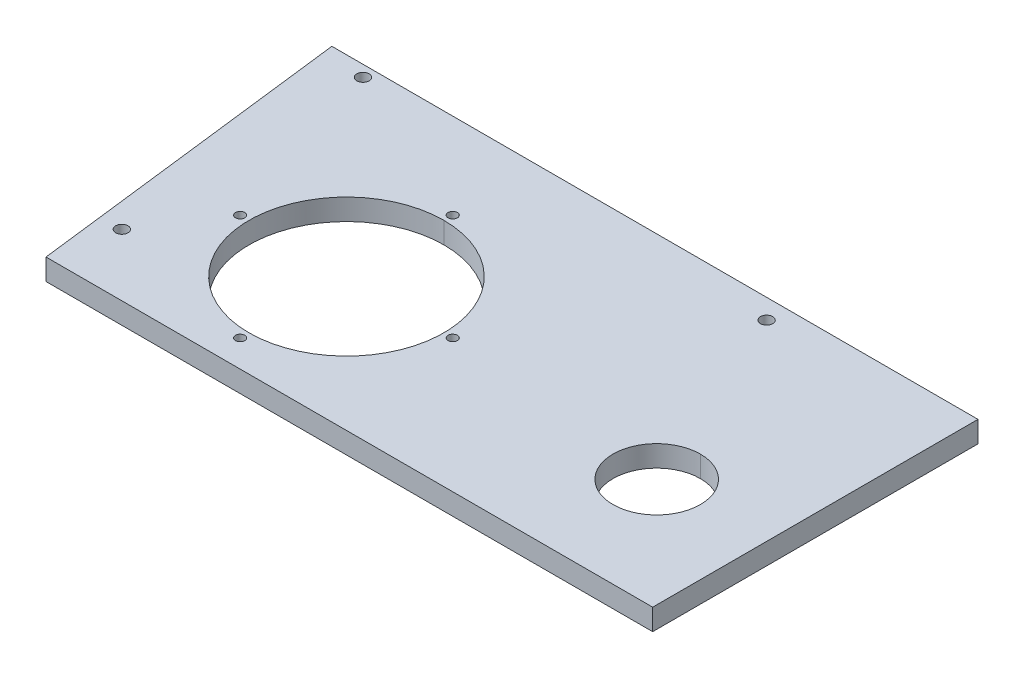
ISO-10303-21;
HEADER;
FILE_DESCRIPTION(('STEP AP214'),'2;1');
FILE_NAME('part.step','',(''),(''),'','','');
FILE_SCHEMA(('AUTOMOTIVE_DESIGN { 1 0 10303 214 1 1 1 1 }'));
ENDSEC;
DATA;
#1=APPLICATION_CONTEXT('core data for automotive mechanical design processes');
#2=APPLICATION_PROTOCOL_DEFINITION('international standard','automotive_design',2000,#1);
#3=PRODUCT_CONTEXT('',#1,'mechanical');
#4=PRODUCT('Part','Part','',(#3));
#5=PRODUCT_RELATED_PRODUCT_CATEGORY('part','',(#4));
#6=PRODUCT_DEFINITION_FORMATION('','',#4);
#7=PRODUCT_DEFINITION_CONTEXT('part definition',#1,'design');
#8=PRODUCT_DEFINITION('design','',#6,#7);
#9=PRODUCT_DEFINITION_SHAPE('','',#8);
#10=(LENGTH_UNIT() NAMED_UNIT(*) SI_UNIT(.MILLI.,.METRE.));
#11=(NAMED_UNIT(*) PLANE_ANGLE_UNIT() SI_UNIT($,.RADIAN.));
#12=(NAMED_UNIT(*) SI_UNIT($,.STERADIAN.) SOLID_ANGLE_UNIT());
#13=UNCERTAINTY_MEASURE_WITH_UNIT(LENGTH_MEASURE(1.E-05),#10,'distance_accuracy_value','');
#14=(GEOMETRIC_REPRESENTATION_CONTEXT(3) GLOBAL_UNCERTAINTY_ASSIGNED_CONTEXT((#13)) GLOBAL_UNIT_ASSIGNED_CONTEXT((#10,
#11,#12)) REPRESENTATION_CONTEXT('',''));
#15=CARTESIAN_POINT('',(0.,0.,0.));
#16=DIRECTION('',(0.,0.,1.));
#17=DIRECTION('',(1.,0.,0.));
#18=AXIS2_PLACEMENT_3D('',#15,#16,#17);
#19=CARTESIAN_POINT('',(54.6099999999999,11.43,127.));
#20=DIRECTION('',(0.,-1.,0.));
#21=DIRECTION('',(0.,0.,-1.));
#22=AXIS2_PLACEMENT_3D('',#19,#20,#21);
#23=CYLINDRICAL_SURFACE('',#22,23.5);
#24=CARTESIAN_POINT('',(54.6099999999999,11.43,127.));
#25=DIRECTION('',(0.,1.,0.));
#26=DIRECTION('',(0.,0.,1.));
#27=AXIS2_PLACEMENT_3D('',#24,#25,#26);
#28=CIRCLE('',#27,23.5);
#29=CARTESIAN_POINT('',(54.6099999999999,11.43,103.5));
#30=VERTEX_POINT('',#29);
#31=CARTESIAN_POINT('',(54.6099999999999,11.43,150.5));
#32=VERTEX_POINT('',#31);
#33=EDGE_CURVE('E161',#30,#32,#28,.T.);
#34=ORIENTED_EDGE('',*,*,#33,.T.);
#35=DIRECTION('',(0.,-1.,0.));
#36=VECTOR('',#35,1.);
#37=CARTESIAN_POINT('',(54.6099999999999,11.43,150.5));
#38=LINE('',#37,#36);
#39=CARTESIAN_POINT('',(54.6099999999999,0.,150.5));
#40=VERTEX_POINT('',#39);
#41=EDGE_CURVE('E12',#32,#40,#38,.T.);
#42=ORIENTED_EDGE('',*,*,#41,.T.);
#43=CARTESIAN_POINT('',(54.6099999999999,0.,127.));
#44=DIRECTION('',(0.,1.,0.));
#45=DIRECTION('',(0.,0.,1.));
#46=AXIS2_PLACEMENT_3D('',#43,#44,#45);
#47=CIRCLE('',#46,23.5);
#48=CARTESIAN_POINT('',(54.6099999999999,0.,103.5));
#49=VERTEX_POINT('',#48);
#50=EDGE_CURVE('E163',#49,#40,#47,.T.);
#51=ORIENTED_EDGE('',*,*,#50,.F.);
#52=DIRECTION('',(0.,1.,0.));
#53=VECTOR('',#52,1.);
#54=CARTESIAN_POINT('',(54.6099999999999,11.43,103.5));
#55=LINE('',#54,#53);
#56=EDGE_CURVE('E56',#49,#30,#55,.T.);
#57=ORIENTED_EDGE('',*,*,#56,.T.);
#58=EDGE_LOOP('',(#34,#42,#51,#57));
#59=FACE_BOUND('',#58,.T.);
#60=ADVANCED_FACE('F47',(#59),#23,.F.);
#61=CARTESIAN_POINT('',(-123.19,11.43,116.001477371938));
#62=DIRECTION('',(0.,-1.,0.));
#63=DIRECTION('',(0.,0.,-1.));
#64=AXIS2_PLACEMENT_3D('',#61,#62,#63);
#65=CYLINDRICAL_SURFACE('',#64,52.3875);
#66=CARTESIAN_POINT('',(-123.19,11.43,116.001477371938));
#67=DIRECTION('',(0.,1.,0.));
#68=DIRECTION('',(0.,0.,1.));
#69=AXIS2_PLACEMENT_3D('',#66,#67,#68);
#70=CIRCLE('',#69,52.3875);
#71=CARTESIAN_POINT('',(-123.19,11.43,63.6139773719377));
#72=VERTEX_POINT('',#71);
#73=CARTESIAN_POINT('',(-123.19,11.43,168.388977371938));
#74=VERTEX_POINT('',#73);
#75=EDGE_CURVE('E176',#72,#74,#70,.T.);
#76=ORIENTED_EDGE('',*,*,#75,.T.);
#77=DIRECTION('',(0.,-1.,0.));
#78=VECTOR('',#77,1.);
#79=CARTESIAN_POINT('',(-123.19,11.43,168.388977371938));
#80=LINE('',#79,#78);
#81=CARTESIAN_POINT('',(-123.19,0.,168.388977371938));
#82=VERTEX_POINT('',#81);
#83=EDGE_CURVE('E141',#74,#82,#80,.T.);
#84=ORIENTED_EDGE('',*,*,#83,.T.);
#85=CARTESIAN_POINT('',(-123.19,0.,116.001477371938));
#86=DIRECTION('',(0.,1.,0.));
#87=DIRECTION('',(0.,0.,1.));
#88=AXIS2_PLACEMENT_3D('',#85,#86,#87);
#89=CIRCLE('',#88,52.3875);
#90=CARTESIAN_POINT('',(-123.19,0.,63.6139773719377));
#91=VERTEX_POINT('',#90);
#92=EDGE_CURVE('E168',#91,#82,#89,.T.);
#93=ORIENTED_EDGE('',*,*,#92,.F.);
#94=DIRECTION('',(0.,1.,0.));
#95=VECTOR('',#94,1.);
#96=CARTESIAN_POINT('',(-123.19,11.43,63.6139773719377));
#97=LINE('',#96,#95);
#98=EDGE_CURVE('E137',#91,#72,#97,.T.);
#99=ORIENTED_EDGE('',*,*,#98,.T.);
#100=EDGE_LOOP('',(#76,#84,#93,#99));
#101=FACE_BOUND('',#100,.T.);
#102=ADVANCED_FACE('F210',(#101),#65,.F.);
#103=CARTESIAN_POINT('',(0.,11.43,0.));
#104=DIRECTION('',(0.,1.,0.));
#105=DIRECTION('',(0.,0.,1.));
#106=AXIS2_PLACEMENT_3D('',#103,#104,#105);
#107=PLANE('',#106);
#108=ORIENTED_EDGE('',*,*,#33,.F.);
#109=EDGE_CURVE('E165',#32,#30,#28,.T.);
#110=ORIENTED_EDGE('',*,*,#109,.F.);
#111=EDGE_LOOP('',(#108,#110));
#112=FACE_BOUND('',#111,.T.);
#113=DIRECTION('',(0.120650785372085,0.,0.992695012573902));
#114=VECTOR('',#113,1.);
#115=CARTESIAN_POINT('',(-234.329030184165,11.43,12.7));
#116=LINE('',#115,#114);
#117=CARTESIAN_POINT('',(-234.329030184165,11.43,12.7));
#118=VERTEX_POINT('',#117);
#119=CARTESIAN_POINT('',(-213.064788009342,11.43,187.658721470491));
#120=VERTEX_POINT('',#119);
#121=EDGE_CURVE('E123',#118,#120,#116,.T.);
#122=ORIENTED_EDGE('',*,*,#121,.T.);
#123=DIRECTION('',(0.999999986376493,0.,-0.000165066694148165));
#124=VECTOR('',#123,1.);
#125=CARTESIAN_POINT('',(-213.064788009342,11.43,187.658721470491));
#126=LINE('',#125,#124);
#127=CARTESIAN_POINT('',(113.061428613431,11.43,187.604888893304));
#128=VERTEX_POINT('',#127);
#129=EDGE_CURVE('E112',#120,#128,#126,.T.);
#130=ORIENTED_EDGE('',*,*,#129,.T.);
#131=DIRECTION('',(0.,0.,-1.));
#132=VECTOR('',#131,1.);
#133=CARTESIAN_POINT('',(113.061428613431,11.43,12.7));
#134=LINE('',#133,#132);
#135=CARTESIAN_POINT('',(113.061428613431,11.43,12.7));
#136=VERTEX_POINT('',#135);
#137=EDGE_CURVE('E122',#128,#136,#134,.T.);
#138=ORIENTED_EDGE('',*,*,#137,.T.);
#139=DIRECTION('',(-1.,0.,0.));
#140=VECTOR('',#139,1.);
#141=CARTESIAN_POINT('',(-234.329030184165,11.43,12.7));
#142=LINE('',#141,#140);
#143=EDGE_CURVE('E129',#136,#118,#142,.T.);
#144=ORIENTED_EDGE('',*,*,#143,.T.);
#145=EDGE_LOOP('',(#122,#130,#138,#144));
#146=FACE_BOUND('',#145,.T.);
#147=ORIENTED_EDGE('',*,*,#75,.F.);
#148=EDGE_CURVE('E178',#74,#72,#70,.T.);
#149=ORIENTED_EDGE('',*,*,#148,.F.);
#150=EDGE_LOOP('',(#147,#149));
#151=FACE_BOUND('',#150,.T.);
#152=CARTESIAN_POINT('',(-205.575185514482,11.43,154.375359311032));
#153=DIRECTION('',(0.,-1.,0.));
#154=DIRECTION('',(0.,0.,-1.));
#155=AXIS2_PLACEMENT_3D('',#152,#153,#154);
#156=CIRCLE('',#155,3.3);
#157=CARTESIAN_POINT('',(-205.575185514482,11.43,151.075359311032));
#158=VERTEX_POINT('',#157);
#159=EDGE_CURVE('E172',#158,#158,#156,.T.);
#160=ORIENTED_EDGE('',*,*,#159,.T.);
#161=EDGE_LOOP('',(#160));
#162=FACE_BOUND('',#161,.T.);
#163=CARTESIAN_POINT('',(-211.518182886176,11.43,18.79817874396));
#164=DIRECTION('',(0.,-1.,0.));
#165=DIRECTION('',(0.,0.,-1.));
#166=AXIS2_PLACEMENT_3D('',#163,#164,#165);
#167=CIRCLE('',#166,3.3);
#168=CARTESIAN_POINT('',(-211.518182886176,11.43,15.49817874396));
#169=VERTEX_POINT('',#168);
#170=EDGE_CURVE('E266',#169,#169,#167,.T.);
#171=ORIENTED_EDGE('',*,*,#170,.T.);
#172=EDGE_LOOP('',(#171));
#173=FACE_BOUND('',#172,.T.);
#174=CARTESIAN_POINT('',(10.0337048667491,11.43,23.3341973645329));
#175=DIRECTION('',(0.,-1.,0.));
#176=DIRECTION('',(0.,0.,-1.));
#177=AXIS2_PLACEMENT_3D('',#174,#175,#176);
#178=CIRCLE('',#177,3.3);
#179=CARTESIAN_POINT('',(10.0337048667491,11.43,20.0341973645329));
#180=VERTEX_POINT('',#179);
#181=EDGE_CURVE('E272',#180,#180,#178,.T.);
#182=ORIENTED_EDGE('',*,*,#181,.T.);
#183=EDGE_LOOP('',(#182));
#184=FACE_BOUND('',#183,.T.);
#185=CARTESIAN_POINT('',(-123.19,11.43,173.151477371938));
#186=DIRECTION('',(0.,-1.,0.));
#187=DIRECTION('',(0.,0.,-1.));
#188=AXIS2_PLACEMENT_3D('',#185,#186,#187);
#189=CIRCLE('',#188,2.5);
#190=CARTESIAN_POINT('',(-123.19,11.43,170.651477371938));
#191=VERTEX_POINT('',#190);
#192=EDGE_CURVE('E276',#191,#191,#189,.T.);
#193=ORIENTED_EDGE('',*,*,#192,.T.);
#194=EDGE_LOOP('',(#193));
#195=FACE_BOUND('',#194,.T.);
#196=CARTESIAN_POINT('',(-180.34,11.43,116.001477371938));
#197=DIRECTION('',(0.,-1.,0.));
#198=DIRECTION('',(0.,0.,-1.));
#199=AXIS2_PLACEMENT_3D('',#196,#197,#198);
#200=CIRCLE('',#199,2.5);
#201=CARTESIAN_POINT('',(-180.34,11.43,113.501477371938));
#202=VERTEX_POINT('',#201);
#203=EDGE_CURVE('E280',#202,#202,#200,.T.);
#204=ORIENTED_EDGE('',*,*,#203,.T.);
#205=EDGE_LOOP('',(#204));
#206=FACE_BOUND('',#205,.T.);
#207=CARTESIAN_POINT('',(-123.19,11.43,58.8514773719377));
#208=DIRECTION('',(0.,-1.,0.));
#209=DIRECTION('',(0.,0.,-1.));
#210=AXIS2_PLACEMENT_3D('',#207,#208,#209);
#211=CIRCLE('',#210,2.5);
#212=CARTESIAN_POINT('',(-123.19,11.43,56.3514773719377));
#213=VERTEX_POINT('',#212);
#214=EDGE_CURVE('E284',#213,#213,#211,.T.);
#215=ORIENTED_EDGE('',*,*,#214,.T.);
#216=EDGE_LOOP('',(#215));
#217=FACE_BOUND('',#216,.T.);
#218=CARTESIAN_POINT('',(-66.04,11.43,116.001477371938));
#219=DIRECTION('',(0.,-1.,0.));
#220=DIRECTION('',(0.,0.,-1.));
#221=AXIS2_PLACEMENT_3D('',#218,#219,#220);
#222=CIRCLE('',#221,2.5);
#223=CARTESIAN_POINT('',(-66.04,11.43,113.501477371938));
#224=VERTEX_POINT('',#223);
#225=EDGE_CURVE('E288',#224,#224,#222,.T.);
#226=ORIENTED_EDGE('',*,*,#225,.T.);
#227=EDGE_LOOP('',(#226));
#228=FACE_BOUND('',#227,.T.);
#229=ADVANCED_FACE('F126',(#112,#146,#151,#162,#173,#184,#195,#206,#217,#228),#107,.T.);
#230=CARTESIAN_POINT('',(0.,0.,0.));
#231=DIRECTION('',(0.,1.,0.));
#232=DIRECTION('',(0.,0.,1.));
#233=AXIS2_PLACEMENT_3D('',#230,#231,#232);
#234=PLANE('',#233);
#235=CARTESIAN_POINT('',(-66.04,0.,116.001477371938));
#236=DIRECTION('',(0.,-1.,0.));
#237=DIRECTION('',(0.,0.,-1.));
#238=AXIS2_PLACEMENT_3D('',#235,#236,#237);
#239=CIRCLE('',#238,2.49999999999999);
#240=CARTESIAN_POINT('',(-66.04,0.,113.501477371938));
#241=VERTEX_POINT('',#240);
#242=EDGE_CURVE('E241',#241,#241,#239,.T.);
#243=ORIENTED_EDGE('',*,*,#242,.F.);
#244=EDGE_LOOP('',(#243));
#245=FACE_BOUND('',#244,.T.);
#246=CARTESIAN_POINT('',(-123.19,0.,58.8514773719377));
#247=DIRECTION('',(0.,-1.,0.));
#248=DIRECTION('',(0.,0.,-1.));
#249=AXIS2_PLACEMENT_3D('',#246,#247,#248);
#250=CIRCLE('',#249,2.49999999999999);
#251=CARTESIAN_POINT('',(-123.19,0.,56.3514773719378));
#252=VERTEX_POINT('',#251);
#253=EDGE_CURVE('E245',#252,#252,#250,.T.);
#254=ORIENTED_EDGE('',*,*,#253,.F.);
#255=EDGE_LOOP('',(#254));
#256=FACE_BOUND('',#255,.T.);
#257=CARTESIAN_POINT('',(-180.34,0.,116.001477371938));
#258=DIRECTION('',(0.,-1.,0.));
#259=DIRECTION('',(0.,0.,-1.));
#260=AXIS2_PLACEMENT_3D('',#257,#258,#259);
#261=CIRCLE('',#260,2.49999999999997);
#262=CARTESIAN_POINT('',(-180.34,0.,113.501477371938));
#263=VERTEX_POINT('',#262);
#264=EDGE_CURVE('E249',#263,#263,#261,.T.);
#265=ORIENTED_EDGE('',*,*,#264,.F.);
#266=EDGE_LOOP('',(#265));
#267=FACE_BOUND('',#266,.T.);
#268=CARTESIAN_POINT('',(-123.19,0.,173.151477371938));
#269=DIRECTION('',(0.,-1.,0.));
#270=DIRECTION('',(0.,0.,-1.));
#271=AXIS2_PLACEMENT_3D('',#268,#269,#270);
#272=CIRCLE('',#271,2.49999999999999);
#273=CARTESIAN_POINT('',(-123.19,0.,170.651477371938));
#274=VERTEX_POINT('',#273);
#275=EDGE_CURVE('E253',#274,#274,#272,.T.);
#276=ORIENTED_EDGE('',*,*,#275,.F.);
#277=EDGE_LOOP('',(#276));
#278=FACE_BOUND('',#277,.T.);
#279=CARTESIAN_POINT('',(10.0337048667491,0.,23.3341973645329));
#280=DIRECTION('',(0.,-1.,0.));
#281=DIRECTION('',(0.,0.,-1.));
#282=AXIS2_PLACEMENT_3D('',#279,#280,#281);
#283=CIRCLE('',#282,3.29999999999999);
#284=CARTESIAN_POINT('',(10.0337048667491,0.,20.0341973645329));
#285=VERTEX_POINT('',#284);
#286=EDGE_CURVE('E257',#285,#285,#283,.T.);
#287=ORIENTED_EDGE('',*,*,#286,.F.);
#288=EDGE_LOOP('',(#287));
#289=FACE_BOUND('',#288,.T.);
#290=CARTESIAN_POINT('',(-211.518182886176,0.,18.79817874396));
#291=DIRECTION('',(0.,-1.,0.));
#292=DIRECTION('',(0.,0.,-1.));
#293=AXIS2_PLACEMENT_3D('',#290,#291,#292);
#294=CIRCLE('',#293,3.3);
#295=CARTESIAN_POINT('',(-211.518182886176,0.,15.49817874396));
#296=VERTEX_POINT('',#295);
#297=EDGE_CURVE('E261',#296,#296,#294,.T.);
#298=ORIENTED_EDGE('',*,*,#297,.F.);
#299=EDGE_LOOP('',(#298));
#300=FACE_BOUND('',#299,.T.);
#301=CARTESIAN_POINT('',(-205.575185514482,0.,154.375359311032));
#302=DIRECTION('',(0.,-1.,0.));
#303=DIRECTION('',(0.,0.,-1.));
#304=AXIS2_PLACEMENT_3D('',#301,#302,#303);
#305=CIRCLE('',#304,3.3);
#306=CARTESIAN_POINT('',(-205.575185514482,0.,151.075359311032));
#307=VERTEX_POINT('',#306);
#308=EDGE_CURVE('E264',#307,#307,#305,.T.);
#309=ORIENTED_EDGE('',*,*,#308,.F.);
#310=EDGE_LOOP('',(#309));
#311=FACE_BOUND('',#310,.T.);
#312=DIRECTION('',(0.120650785372085,0.,0.992695012573902));
#313=VECTOR('',#312,1.);
#314=CARTESIAN_POINT('',(-234.329030184165,0.,12.7));
#315=LINE('',#314,#313);
#316=CARTESIAN_POINT('',(-234.329030184165,0.,12.7));
#317=VERTEX_POINT('',#316);
#318=CARTESIAN_POINT('',(-213.064788009342,0.,187.658721470491));
#319=VERTEX_POINT('',#318);
#320=EDGE_CURVE('E136',#317,#319,#315,.T.);
#321=ORIENTED_EDGE('',*,*,#320,.F.);
#322=DIRECTION('',(-1.,0.,0.));
#323=VECTOR('',#322,1.);
#324=CARTESIAN_POINT('',(-234.329030184165,0.,12.7));
#325=LINE('',#324,#323);
#326=CARTESIAN_POINT('',(113.061428613431,0.,12.7));
#327=VERTEX_POINT('',#326);
#328=EDGE_CURVE('E133',#327,#317,#325,.T.);
#329=ORIENTED_EDGE('',*,*,#328,.F.);
#330=DIRECTION('',(0.,0.,-1.));
#331=VECTOR('',#330,1.);
#332=CARTESIAN_POINT('',(113.061428613431,0.,12.7));
#333=LINE('',#332,#331);
#334=CARTESIAN_POINT('',(113.061428613431,0.,187.604888893304));
#335=VERTEX_POINT('',#334);
#336=EDGE_CURVE('E187',#335,#327,#333,.T.);
#337=ORIENTED_EDGE('',*,*,#336,.F.);
#338=DIRECTION('',(0.999999986376493,0.,-0.000165066694148165));
#339=VECTOR('',#338,1.);
#340=CARTESIAN_POINT('',(-213.064788009342,0.,187.658721470491));
#341=LINE('',#340,#339);
#342=EDGE_CURVE('E185',#319,#335,#341,.T.);
#343=ORIENTED_EDGE('',*,*,#342,.F.);
#344=EDGE_LOOP('',(#321,#329,#337,#343));
#345=FACE_BOUND('',#344,.T.);
#346=ORIENTED_EDGE('',*,*,#92,.T.);
#347=EDGE_CURVE('E166',#82,#91,#89,.T.);
#348=ORIENTED_EDGE('',*,*,#347,.T.);
#349=EDGE_LOOP('',(#346,#348));
#350=FACE_BOUND('',#349,.T.);
#351=ORIENTED_EDGE('',*,*,#50,.T.);
#352=EDGE_CURVE('E175',#40,#49,#47,.T.);
#353=ORIENTED_EDGE('',*,*,#352,.T.);
#354=EDGE_LOOP('',(#351,#353));
#355=FACE_BOUND('',#354,.T.);
#356=ADVANCED_FACE('F198',(#245,#256,#267,#278,#289,#300,#311,#345,#350,#355),#234,.F.);
#357=CARTESIAN_POINT('',(-234.329030184165,11.43,12.7));
#358=DIRECTION('',(0.992695012573902,0.,-0.120650785372085));
#359=DIRECTION('',(-0.120650785372085,0.,-0.992695012573902));
#360=AXIS2_PLACEMENT_3D('',#357,#358,#359);
#361=PLANE('',#360);
#362=ORIENTED_EDGE('',*,*,#320,.T.);
#363=DIRECTION('',(0.,-1.,0.));
#364=VECTOR('',#363,1.);
#365=CARTESIAN_POINT('',(-213.064788009342,11.43,187.658721470491));
#366=LINE('',#365,#364);
#367=EDGE_CURVE('E116',#120,#319,#366,.T.);
#368=ORIENTED_EDGE('',*,*,#367,.F.);
#369=ORIENTED_EDGE('',*,*,#121,.F.);
#370=DIRECTION('',(0.,-1.,0.));
#371=VECTOR('',#370,1.);
#372=CARTESIAN_POINT('',(-234.329030184165,11.43,12.7));
#373=LINE('',#372,#371);
#374=EDGE_CURVE('E183',#118,#317,#373,.T.);
#375=ORIENTED_EDGE('',*,*,#374,.T.);
#376=EDGE_LOOP('',(#362,#368,#369,#375));
#377=FACE_BOUND('',#376,.T.);
#378=ADVANCED_FACE('F49',(#377),#361,.F.);
#379=CARTESIAN_POINT('',(-213.064788009342,11.43,187.658721470491));
#380=DIRECTION('',(-0.000165066694148165,0.,-0.999999986376493));
#381=DIRECTION('',(-0.999999986376493,0.,0.000165066694148165));
#382=AXIS2_PLACEMENT_3D('',#379,#380,#381);
#383=PLANE('',#382);
#384=ORIENTED_EDGE('',*,*,#342,.T.);
#385=DIRECTION('',(0.,-1.,0.));
#386=VECTOR('',#385,1.);
#387=CARTESIAN_POINT('',(113.061428613431,11.43,187.604888893304));
#388=LINE('',#387,#386);
#389=EDGE_CURVE('E119',#128,#335,#388,.T.);
#390=ORIENTED_EDGE('',*,*,#389,.F.);
#391=ORIENTED_EDGE('',*,*,#129,.F.);
#392=ORIENTED_EDGE('',*,*,#367,.T.);
#393=EDGE_LOOP('',(#384,#390,#391,#392));
#394=FACE_BOUND('',#393,.T.);
#395=ADVANCED_FACE('F114',(#394),#383,.F.);
#396=CARTESIAN_POINT('',(113.061428613431,11.43,12.7));
#397=DIRECTION('',(-1.,0.,0.));
#398=DIRECTION('',(0.,0.,1.));
#399=AXIS2_PLACEMENT_3D('',#396,#397,#398);
#400=PLANE('',#399);
#401=ORIENTED_EDGE('',*,*,#336,.T.);
#402=DIRECTION('',(0.,-1.,0.));
#403=VECTOR('',#402,1.);
#404=CARTESIAN_POINT('',(113.061428613431,11.43,12.7));
#405=LINE('',#404,#403);
#406=EDGE_CURVE('E142',#136,#327,#405,.T.);
#407=ORIENTED_EDGE('',*,*,#406,.F.);
#408=ORIENTED_EDGE('',*,*,#137,.F.);
#409=ORIENTED_EDGE('',*,*,#389,.T.);
#410=EDGE_LOOP('',(#401,#407,#408,#409));
#411=FACE_BOUND('',#410,.T.);
#412=ADVANCED_FACE('F200',(#411),#400,.F.);
#413=CARTESIAN_POINT('',(-234.329030184165,11.43,12.7));
#414=DIRECTION('',(0.,0.,1.));
#415=DIRECTION('',(1.,0.,0.));
#416=AXIS2_PLACEMENT_3D('',#413,#414,#415);
#417=PLANE('',#416);
#418=ORIENTED_EDGE('',*,*,#328,.T.);
#419=ORIENTED_EDGE('',*,*,#374,.F.);
#420=ORIENTED_EDGE('',*,*,#143,.F.);
#421=ORIENTED_EDGE('',*,*,#406,.T.);
#422=EDGE_LOOP('',(#418,#419,#420,#421));
#423=FACE_BOUND('',#422,.T.);
#424=ADVANCED_FACE('F194',(#423),#417,.F.);
#425=ORIENTED_EDGE('',*,*,#83,.F.);
#426=ORIENTED_EDGE('',*,*,#148,.T.);
#427=ORIENTED_EDGE('',*,*,#98,.F.);
#428=ORIENTED_EDGE('',*,*,#347,.F.);
#429=EDGE_LOOP('',(#425,#426,#427,#428));
#430=FACE_BOUND('',#429,.T.);
#431=ADVANCED_FACE('F207',(#430),#65,.F.);
#432=ORIENTED_EDGE('',*,*,#41,.F.);
#433=ORIENTED_EDGE('',*,*,#109,.T.);
#434=ORIENTED_EDGE('',*,*,#56,.F.);
#435=ORIENTED_EDGE('',*,*,#352,.F.);
#436=EDGE_LOOP('',(#432,#433,#434,#435));
#437=FACE_BOUND('',#436,.T.);
#438=ADVANCED_FACE('F212',(#437),#23,.F.);
#439=CARTESIAN_POINT('',(-205.575185514482,0.,154.375359311032));
#440=DIRECTION('',(0.,-1.,0.));
#441=DIRECTION('',(0.,0.,-1.));
#442=AXIS2_PLACEMENT_3D('',#439,#440,#441);
#443=CYLINDRICAL_SURFACE('',#442,3.3);
#444=ORIENTED_EDGE('',*,*,#159,.F.);
#445=EDGE_LOOP('',(#444));
#446=FACE_BOUND('',#445,.T.);
#447=ORIENTED_EDGE('',*,*,#308,.T.);
#448=EDGE_LOOP('',(#447));
#449=FACE_BOUND('',#448,.T.);
#450=ADVANCED_FACE('F220',(#446,#449),#443,.F.);
#451=CARTESIAN_POINT('',(-211.518182886176,0.,18.79817874396));
#452=DIRECTION('',(0.,-1.,0.));
#453=DIRECTION('',(0.,0.,-1.));
#454=AXIS2_PLACEMENT_3D('',#451,#452,#453);
#455=CYLINDRICAL_SURFACE('',#454,3.3);
#456=ORIENTED_EDGE('',*,*,#170,.F.);
#457=EDGE_LOOP('',(#456));
#458=FACE_BOUND('',#457,.T.);
#459=ORIENTED_EDGE('',*,*,#297,.T.);
#460=EDGE_LOOP('',(#459));
#461=FACE_BOUND('',#460,.T.);
#462=ADVANCED_FACE('F225',(#458,#461),#455,.F.);
#463=CARTESIAN_POINT('',(10.0337048667491,0.,23.3341973645329));
#464=DIRECTION('',(0.,-1.,0.));
#465=DIRECTION('',(0.,0.,-1.));
#466=AXIS2_PLACEMENT_3D('',#463,#464,#465);
#467=CYLINDRICAL_SURFACE('',#466,3.29999999999999);
#468=ORIENTED_EDGE('',*,*,#181,.F.);
#469=EDGE_LOOP('',(#468));
#470=FACE_BOUND('',#469,.T.);
#471=ORIENTED_EDGE('',*,*,#286,.T.);
#472=EDGE_LOOP('',(#471));
#473=FACE_BOUND('',#472,.T.);
#474=ADVANCED_FACE('F311',(#470,#473),#467,.F.);
#475=CARTESIAN_POINT('',(-123.19,0.,173.151477371938));
#476=DIRECTION('',(0.,-1.,0.));
#477=DIRECTION('',(0.,0.,-1.));
#478=AXIS2_PLACEMENT_3D('',#475,#476,#477);
#479=CYLINDRICAL_SURFACE('',#478,2.5);
#480=ORIENTED_EDGE('',*,*,#192,.F.);
#481=EDGE_LOOP('',(#480));
#482=FACE_BOUND('',#481,.T.);
#483=ORIENTED_EDGE('',*,*,#275,.T.);
#484=EDGE_LOOP('',(#483));
#485=FACE_BOUND('',#484,.T.);
#486=ADVANCED_FACE('F307',(#482,#485),#479,.F.);
#487=CARTESIAN_POINT('',(-180.34,0.,116.001477371938));
#488=DIRECTION('',(0.,-1.,0.));
#489=DIRECTION('',(0.,0.,-1.));
#490=AXIS2_PLACEMENT_3D('',#487,#488,#489);
#491=CYLINDRICAL_SURFACE('',#490,2.49999999999999);
#492=ORIENTED_EDGE('',*,*,#203,.F.);
#493=EDGE_LOOP('',(#492));
#494=FACE_BOUND('',#493,.T.);
#495=ORIENTED_EDGE('',*,*,#264,.T.);
#496=EDGE_LOOP('',(#495));
#497=FACE_BOUND('',#496,.T.);
#498=ADVANCED_FACE('F300',(#494,#497),#491,.F.);
#499=CARTESIAN_POINT('',(-123.19,0.,58.8514773719377));
#500=DIRECTION('',(0.,-1.,0.));
#501=DIRECTION('',(0.,0.,-1.));
#502=AXIS2_PLACEMENT_3D('',#499,#500,#501);
#503=CYLINDRICAL_SURFACE('',#502,2.5);
#504=ORIENTED_EDGE('',*,*,#214,.F.);
#505=EDGE_LOOP('',(#504));
#506=FACE_BOUND('',#505,.T.);
#507=ORIENTED_EDGE('',*,*,#253,.T.);
#508=EDGE_LOOP('',(#507));
#509=FACE_BOUND('',#508,.T.);
#510=ADVANCED_FACE('F294',(#506,#509),#503,.F.);
#511=CARTESIAN_POINT('',(-66.04,0.,116.001477371938));
#512=DIRECTION('',(0.,-1.,0.));
#513=DIRECTION('',(0.,0.,-1.));
#514=AXIS2_PLACEMENT_3D('',#511,#512,#513);
#515=CYLINDRICAL_SURFACE('',#514,2.5);
#516=ORIENTED_EDGE('',*,*,#225,.F.);
#517=EDGE_LOOP('',(#516));
#518=FACE_BOUND('',#517,.T.);
#519=ORIENTED_EDGE('',*,*,#242,.T.);
#520=EDGE_LOOP('',(#519));
#521=FACE_BOUND('',#520,.T.);
#522=ADVANCED_FACE('F292',(#518,#521),#515,.F.);
#523=CLOSED_SHELL('',(#60,#102,#229,#356,#378,#395,#412,#424,#431,#438,#450,#462,#474,#486,#498,
#510,#522));
#524=MANIFOLD_SOLID_BREP('B2',#523);
#525=ADVANCED_BREP_SHAPE_REPRESENTATION('',(#18,#524),#14);
#526=SHAPE_DEFINITION_REPRESENTATION(#9,#525);
ENDSEC;
END-ISO-10303-21;
